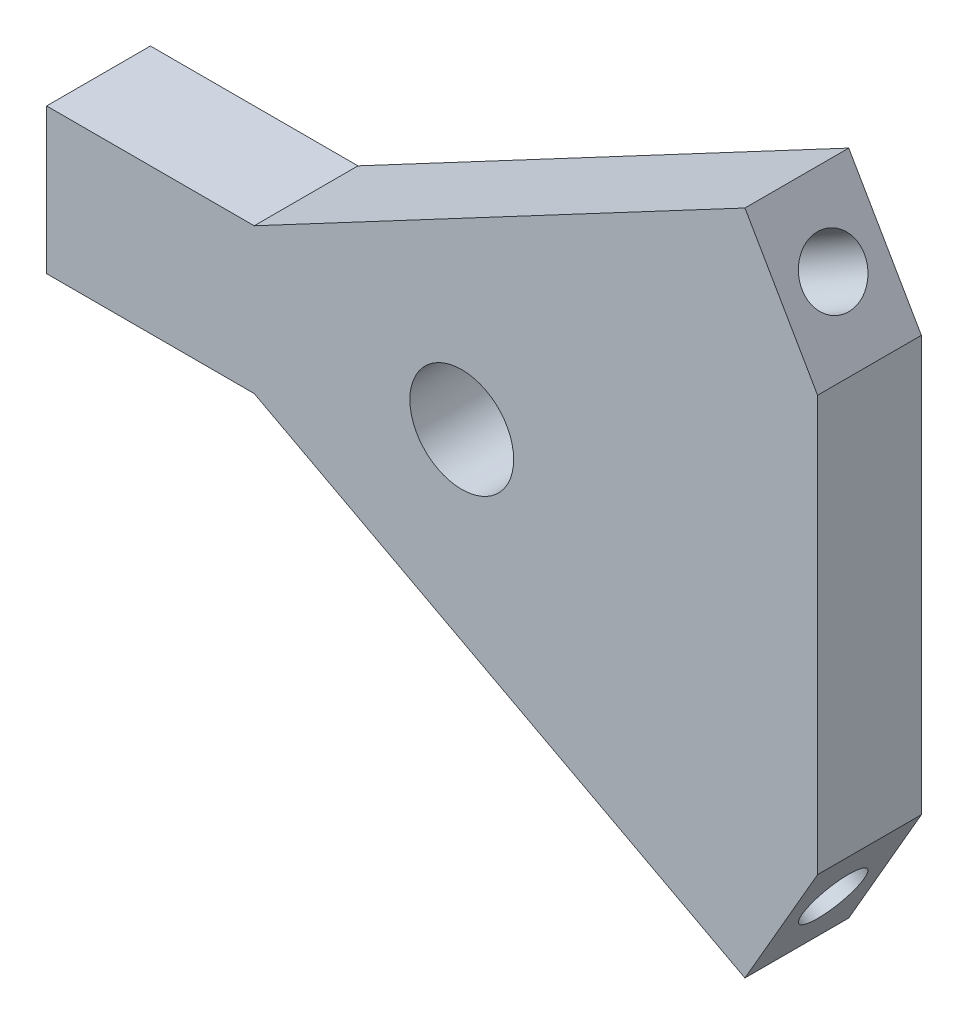
ISO-10303-21;
HEADER;
FILE_DESCRIPTION(('STEP AP214'),'2;1');
FILE_NAME('part.step','',(''),(''),'','','');
FILE_SCHEMA(('AUTOMOTIVE_DESIGN { 1 0 10303 214 1 1 1 1 }'));
ENDSEC;
DATA;
#1=APPLICATION_CONTEXT('core data for automotive mechanical design processes');
#2=APPLICATION_PROTOCOL_DEFINITION('international standard','automotive_design',2000,#1);
#3=PRODUCT_CONTEXT('',#1,'mechanical');
#4=PRODUCT('Part','Part','',(#3));
#5=PRODUCT_RELATED_PRODUCT_CATEGORY('part','',(#4));
#6=PRODUCT_DEFINITION_FORMATION('','',#4);
#7=PRODUCT_DEFINITION_CONTEXT('part definition',#1,'design');
#8=PRODUCT_DEFINITION('design','',#6,#7);
#9=PRODUCT_DEFINITION_SHAPE('','',#8);
#10=(LENGTH_UNIT() NAMED_UNIT(*) SI_UNIT(.MILLI.,.METRE.));
#11=(NAMED_UNIT(*) PLANE_ANGLE_UNIT() SI_UNIT($,.RADIAN.));
#12=(NAMED_UNIT(*) SI_UNIT($,.STERADIAN.) SOLID_ANGLE_UNIT());
#13=UNCERTAINTY_MEASURE_WITH_UNIT(LENGTH_MEASURE(1.E-05),#10,'distance_accuracy_value','');
#14=(GEOMETRIC_REPRESENTATION_CONTEXT(3) GLOBAL_UNCERTAINTY_ASSIGNED_CONTEXT((#13)) GLOBAL_UNIT_ASSIGNED_CONTEXT((#10,
#11,#12)) REPRESENTATION_CONTEXT('',''));
#15=CARTESIAN_POINT('',(0.,0.,0.));
#16=DIRECTION('',(0.,0.,1.));
#17=DIRECTION('',(1.,0.,0.));
#18=AXIS2_PLACEMENT_3D('',#15,#16,#17);
#19=CARTESIAN_POINT('',(47.2820323027583,32.1243556529825,10.));
#20=DIRECTION('',(-0.866025403784442,-0.499999999999995,0.));
#21=DIRECTION('',(0.499999999999995,-0.866025403784442,0.));
#22=AXIS2_PLACEMENT_3D('',#19,#20,#21);
#23=PLANE('',#22);
#24=CARTESIAN_POINT('',(50.7820323027581,26.0621778264916,5.));
#25=DIRECTION('',(0.866025403784441,0.499999999999995,0.));
#26=DIRECTION('',(-0.499999999999995,0.866025403784441,0.));
#27=AXIS2_PLACEMENT_3D('',#24,#25,#26);
#28=CIRCLE('',#27,3.);
#29=CARTESIAN_POINT('',(49.2820323027581,28.6602540378449,5.));
#30=VERTEX_POINT('',#29);
#31=EDGE_CURVE('E183',#30,#30,#28,.T.);
#32=ORIENTED_EDGE('',*,*,#31,.F.);
#33=EDGE_LOOP('',(#32));
#34=FACE_BOUND('',#33,.T.);
#35=DIRECTION('',(-0.499999999999995,0.866025403784442,0.));
#36=VECTOR('',#35,1.);
#37=CARTESIAN_POINT('',(47.2820323027583,32.1243556529825,0.));
#38=LINE('',#37,#36);
#39=CARTESIAN_POINT('',(54.2820323027582,20.0000000000003,0.));
#40=VERTEX_POINT('',#39);
#41=CARTESIAN_POINT('',(47.2820323027583,32.1243556529825,0.));
#42=VERTEX_POINT('',#41);
#43=EDGE_CURVE('E129',#40,#42,#38,.T.);
#44=ORIENTED_EDGE('',*,*,#43,.T.);
#45=DIRECTION('',(0.,0.,-1.));
#46=VECTOR('',#45,1.);
#47=CARTESIAN_POINT('',(47.2820323027583,32.1243556529825,10.));
#48=LINE('',#47,#46);
#49=CARTESIAN_POINT('',(47.2820323027583,32.1243556529825,10.));
#50=VERTEX_POINT('',#49);
#51=EDGE_CURVE('E11',#50,#42,#48,.T.);
#52=ORIENTED_EDGE('',*,*,#51,.F.);
#53=DIRECTION('',(-0.499999999999995,0.866025403784442,0.));
#54=VECTOR('',#53,1.);
#55=CARTESIAN_POINT('',(47.2820323027583,32.1243556529825,10.));
#56=LINE('',#55,#54);
#57=CARTESIAN_POINT('',(54.2820323027582,20.0000000000003,10.));
#58=VERTEX_POINT('',#57);
#59=EDGE_CURVE('E144',#58,#50,#56,.T.);
#60=ORIENTED_EDGE('',*,*,#59,.F.);
#61=DIRECTION('',(0.,0.,-1.));
#62=VECTOR('',#61,1.);
#63=CARTESIAN_POINT('',(54.2820323027582,20.0000000000003,10.));
#64=LINE('',#63,#62);
#65=EDGE_CURVE('E125',#58,#40,#64,.T.);
#66=ORIENTED_EDGE('',*,*,#65,.T.);
#67=EDGE_LOOP('',(#44,#52,#60,#66));
#68=FACE_BOUND('',#67,.T.);
#69=ADVANCED_FACE('F33',(#34,#68),#23,.F.);
#70=CARTESIAN_POINT('',(0.,7.00000000000019,10.));
#71=DIRECTION('',(0.469239355853782,-0.883071020313727,0.));
#72=DIRECTION('',(0.883071020313728,0.469239355853782,0.));
#73=AXIS2_PLACEMENT_3D('',#70,#71,#72);
#74=PLANE('',#73);
#75=DIRECTION('',(-0.883071020313728,-0.469239355853782,0.));
#76=VECTOR('',#75,1.);
#77=CARTESIAN_POINT('',(0.,7.00000000000019,0.));
#78=LINE('',#77,#76);
#79=CARTESIAN_POINT('',(0.,7.00000000000019,0.));
#80=VERTEX_POINT('',#79);
#81=EDGE_CURVE('E132',#42,#80,#78,.T.);
#82=ORIENTED_EDGE('',*,*,#81,.T.);
#83=DIRECTION('',(0.,0.,-1.));
#84=VECTOR('',#83,1.);
#85=CARTESIAN_POINT('',(0.,7.00000000000019,10.));
#86=LINE('',#85,#84);
#87=CARTESIAN_POINT('',(0.,7.00000000000019,10.));
#88=VERTEX_POINT('',#87);
#89=EDGE_CURVE('E41',#88,#80,#86,.T.);
#90=ORIENTED_EDGE('',*,*,#89,.F.);
#91=DIRECTION('',(-0.883071020313728,-0.469239355853782,0.));
#92=VECTOR('',#91,1.);
#93=CARTESIAN_POINT('',(0.,7.00000000000019,10.));
#94=LINE('',#93,#92);
#95=EDGE_CURVE('E92',#50,#88,#94,.T.);
#96=ORIENTED_EDGE('',*,*,#95,.F.);
#97=ORIENTED_EDGE('',*,*,#51,.T.);
#98=EDGE_LOOP('',(#82,#90,#96,#97));
#99=FACE_BOUND('',#98,.T.);
#100=ADVANCED_FACE('F218',(#99),#74,.F.);
#101=CARTESIAN_POINT('',(-20.,7.00000000000019,10.));
#102=DIRECTION('',(0.,-1.,0.));
#103=DIRECTION('',(0.,0.,-1.));
#104=AXIS2_PLACEMENT_3D('',#101,#102,#103);
#105=PLANE('',#104);
#106=DIRECTION('',(-1.,0.,0.));
#107=VECTOR('',#106,1.);
#108=CARTESIAN_POINT('',(-20.,7.00000000000019,0.));
#109=LINE('',#108,#107);
#110=CARTESIAN_POINT('',(-20.,7.00000000000019,0.));
#111=VERTEX_POINT('',#110);
#112=EDGE_CURVE('E135',#80,#111,#109,.T.);
#113=ORIENTED_EDGE('',*,*,#112,.T.);
#114=DIRECTION('',(0.,0.,-1.));
#115=VECTOR('',#114,1.);
#116=CARTESIAN_POINT('',(-20.,7.00000000000019,10.));
#117=LINE('',#116,#115);
#118=CARTESIAN_POINT('',(-20.,7.00000000000019,10.));
#119=VERTEX_POINT('',#118);
#120=EDGE_CURVE('E151',#119,#111,#117,.T.);
#121=ORIENTED_EDGE('',*,*,#120,.F.);
#122=DIRECTION('',(-1.,0.,0.));
#123=VECTOR('',#122,1.);
#124=CARTESIAN_POINT('',(-20.,7.00000000000019,10.));
#125=LINE('',#124,#123);
#126=EDGE_CURVE('E159',#88,#119,#125,.T.);
#127=ORIENTED_EDGE('',*,*,#126,.F.);
#128=ORIENTED_EDGE('',*,*,#89,.T.);
#129=EDGE_LOOP('',(#113,#121,#127,#128));
#130=FACE_BOUND('',#129,.T.);
#131=ADVANCED_FACE('F157',(#130),#105,.F.);
#132=CARTESIAN_POINT('',(-20.,-6.99999999999981,10.));
#133=DIRECTION('',(1.,0.,0.));
#134=DIRECTION('',(0.,0.,-1.));
#135=AXIS2_PLACEMENT_3D('',#132,#133,#134);
#136=PLANE('',#135);
#137=CARTESIAN_POINT('',(-20.,0.,5.));
#138=DIRECTION('',(-1.,0.,0.));
#139=DIRECTION('',(0.,0.,1.));
#140=AXIS2_PLACEMENT_3D('',#137,#138,#139);
#141=CIRCLE('',#140,3.);
#142=CARTESIAN_POINT('',(-20.,0.,8.));
#143=VERTEX_POINT('',#142);
#144=EDGE_CURVE('E177',#143,#143,#141,.T.);
#145=ORIENTED_EDGE('',*,*,#144,.F.);
#146=EDGE_LOOP('',(#145));
#147=FACE_BOUND('',#146,.T.);
#148=DIRECTION('',(0.,-1.,0.));
#149=VECTOR('',#148,1.);
#150=CARTESIAN_POINT('',(-20.,-6.99999999999981,0.));
#151=LINE('',#150,#149);
#152=CARTESIAN_POINT('',(-20.,-6.99999999999981,0.));
#153=VERTEX_POINT('',#152);
#154=EDGE_CURVE('E137',#111,#153,#151,.T.);
#155=ORIENTED_EDGE('',*,*,#154,.T.);
#156=DIRECTION('',(0.,0.,-1.));
#157=VECTOR('',#156,1.);
#158=CARTESIAN_POINT('',(-20.,-6.99999999999981,10.));
#159=LINE('',#158,#157);
#160=CARTESIAN_POINT('',(-20.,-6.99999999999981,10.));
#161=VERTEX_POINT('',#160);
#162=EDGE_CURVE('E148',#161,#153,#159,.T.);
#163=ORIENTED_EDGE('',*,*,#162,.F.);
#164=DIRECTION('',(0.,-1.,0.));
#165=VECTOR('',#164,1.);
#166=CARTESIAN_POINT('',(-20.,-6.99999999999981,10.));
#167=LINE('',#166,#165);
#168=EDGE_CURVE('E171',#119,#161,#167,.T.);
#169=ORIENTED_EDGE('',*,*,#168,.F.);
#170=ORIENTED_EDGE('',*,*,#120,.T.);
#171=EDGE_LOOP('',(#155,#163,#169,#170));
#172=FACE_BOUND('',#171,.T.);
#173=ADVANCED_FACE('F167',(#147,#172),#136,.F.);
#174=CARTESIAN_POINT('',(-20.,-6.99999999999981,10.));
#175=DIRECTION('',(0.,1.,0.));
#176=DIRECTION('',(0.,0.,1.));
#177=AXIS2_PLACEMENT_3D('',#174,#175,#176);
#178=PLANE('',#177);
#179=DIRECTION('',(1.,0.,0.));
#180=VECTOR('',#179,1.);
#181=CARTESIAN_POINT('',(-20.,-6.99999999999981,0.));
#182=LINE('',#181,#180);
#183=CARTESIAN_POINT('',(0.,-6.99999999999981,0.));
#184=VERTEX_POINT('',#183);
#185=EDGE_CURVE('E139',#153,#184,#182,.T.);
#186=ORIENTED_EDGE('',*,*,#185,.T.);
#187=DIRECTION('',(0.,0.,-1.));
#188=VECTOR('',#187,1.);
#189=CARTESIAN_POINT('',(0.,-6.99999999999981,10.));
#190=LINE('',#189,#188);
#191=CARTESIAN_POINT('',(0.,-6.99999999999981,10.));
#192=VERTEX_POINT('',#191);
#193=EDGE_CURVE('E120',#192,#184,#190,.T.);
#194=ORIENTED_EDGE('',*,*,#193,.F.);
#195=DIRECTION('',(1.,0.,0.));
#196=VECTOR('',#195,1.);
#197=CARTESIAN_POINT('',(-20.,-6.99999999999981,10.));
#198=LINE('',#197,#196);
#199=EDGE_CURVE('E111',#161,#192,#198,.T.);
#200=ORIENTED_EDGE('',*,*,#199,.F.);
#201=ORIENTED_EDGE('',*,*,#162,.T.);
#202=EDGE_LOOP('',(#186,#194,#200,#201));
#203=FACE_BOUND('',#202,.T.);
#204=ADVANCED_FACE('F170',(#203),#178,.F.);
#205=CARTESIAN_POINT('',(0.,-6.99999999999981,10.));
#206=DIRECTION('',(0.469239355853787,0.883071020313725,0.));
#207=DIRECTION('',(-0.883071020313725,0.469239355853787,0.));
#208=AXIS2_PLACEMENT_3D('',#205,#206,#207);
#209=PLANE('',#208);
#210=DIRECTION('',(0.883071020313725,-0.469239355853787,0.));
#211=VECTOR('',#210,1.);
#212=CARTESIAN_POINT('',(0.,-6.99999999999981,0.));
#213=LINE('',#212,#211);
#214=CARTESIAN_POINT('',(47.2820323027578,-32.1243556529822,0.));
#215=VERTEX_POINT('',#214);
#216=EDGE_CURVE('E119',#184,#215,#213,.T.);
#217=ORIENTED_EDGE('',*,*,#216,.T.);
#218=DIRECTION('',(0.,0.,-1.));
#219=VECTOR('',#218,1.);
#220=CARTESIAN_POINT('',(47.2820323027578,-32.1243556529822,10.));
#221=LINE('',#220,#219);
#222=CARTESIAN_POINT('',(47.2820323027578,-32.1243556529822,10.));
#223=VERTEX_POINT('',#222);
#224=EDGE_CURVE('E116',#223,#215,#221,.T.);
#225=ORIENTED_EDGE('',*,*,#224,.F.);
#226=DIRECTION('',(0.883071020313725,-0.469239355853787,0.));
#227=VECTOR('',#226,1.);
#228=CARTESIAN_POINT('',(0.,-6.99999999999981,10.));
#229=LINE('',#228,#227);
#230=EDGE_CURVE('E105',#192,#223,#229,.T.);
#231=ORIENTED_EDGE('',*,*,#230,.F.);
#232=ORIENTED_EDGE('',*,*,#193,.T.);
#233=EDGE_LOOP('',(#217,#225,#231,#232));
#234=FACE_BOUND('',#233,.T.);
#235=ADVANCED_FACE('F117',(#234),#209,.F.);
#236=CARTESIAN_POINT('',(47.2820323027578,-32.1243556529822,10.));
#237=DIRECTION('',(-0.866025403784431,0.500000000000012,0.));
#238=DIRECTION('',(-0.500000000000012,-0.866025403784432,0.));
#239=AXIS2_PLACEMENT_3D('',#236,#237,#238);
#240=PLANE('',#239);
#241=CARTESIAN_POINT('',(50.7820323027582,-26.0621778264908,5.));
#242=DIRECTION('',(0.866025403784424,-0.500000000000026,0.));
#243=DIRECTION('',(0.500000000000026,0.866025403784424,0.));
#244=AXIS2_PLACEMENT_3D('',#241,#242,#243);
#245=CIRCLE('',#244,3.);
#246=CARTESIAN_POINT('',(52.2820323027582,-23.4641016151375,5.));
#247=VERTEX_POINT('',#246);
#248=EDGE_CURVE('E189',#247,#247,#245,.T.);
#249=ORIENTED_EDGE('',*,*,#248,.F.);
#250=EDGE_LOOP('',(#249));
#251=FACE_BOUND('',#250,.T.);
#252=DIRECTION('',(0.500000000000012,0.866025403784432,0.));
#253=VECTOR('',#252,1.);
#254=CARTESIAN_POINT('',(47.2820323027578,-32.1243556529822,0.));
#255=LINE('',#254,#253);
#256=CARTESIAN_POINT('',(54.2820323027582,-19.9999999999997,0.));
#257=VERTEX_POINT('',#256);
#258=EDGE_CURVE('E78',#215,#257,#255,.T.);
#259=ORIENTED_EDGE('',*,*,#258,.T.);
#260=DIRECTION('',(0.,0.,-1.));
#261=VECTOR('',#260,1.);
#262=CARTESIAN_POINT('',(54.2820323027582,-19.9999999999997,10.));
#263=LINE('',#262,#261);
#264=CARTESIAN_POINT('',(54.2820323027582,-19.9999999999997,10.));
#265=VERTEX_POINT('',#264);
#266=EDGE_CURVE('E121',#265,#257,#263,.T.);
#267=ORIENTED_EDGE('',*,*,#266,.F.);
#268=DIRECTION('',(0.500000000000012,0.866025403784432,0.));
#269=VECTOR('',#268,1.);
#270=CARTESIAN_POINT('',(47.2820323027578,-32.1243556529822,10.));
#271=LINE('',#270,#269);
#272=EDGE_CURVE('E109',#223,#265,#271,.T.);
#273=ORIENTED_EDGE('',*,*,#272,.F.);
#274=ORIENTED_EDGE('',*,*,#224,.T.);
#275=EDGE_LOOP('',(#259,#267,#273,#274));
#276=FACE_BOUND('',#275,.T.);
#277=ADVANCED_FACE('F123',(#251,#276),#240,.F.);
#278=CARTESIAN_POINT('',(54.2820323027582,20.0000000000003,10.));
#279=DIRECTION('',(-1.,0.,0.));
#280=DIRECTION('',(0.,-1.,0.));
#281=AXIS2_PLACEMENT_3D('',#278,#279,#280);
#282=PLANE('',#281);
#283=DIRECTION('',(0.,1.,0.));
#284=VECTOR('',#283,1.);
#285=CARTESIAN_POINT('',(54.2820323027582,20.0000000000003,0.));
#286=LINE('',#285,#284);
#287=EDGE_CURVE('E84',#257,#40,#286,.T.);
#288=ORIENTED_EDGE('',*,*,#287,.T.);
#289=ORIENTED_EDGE('',*,*,#65,.F.);
#290=DIRECTION('',(0.,1.,0.));
#291=VECTOR('',#290,1.);
#292=CARTESIAN_POINT('',(54.2820323027582,20.0000000000003,10.));
#293=LINE('',#292,#291);
#294=EDGE_CURVE('E49',#265,#58,#293,.T.);
#295=ORIENTED_EDGE('',*,*,#294,.F.);
#296=ORIENTED_EDGE('',*,*,#266,.T.);
#297=EDGE_LOOP('',(#288,#289,#295,#296));
#298=FACE_BOUND('',#297,.T.);
#299=ADVANCED_FACE('F213',(#298),#282,.F.);
#300=CARTESIAN_POINT('',(0.,0.,10.));
#301=DIRECTION('',(0.,0.,1.));
#302=DIRECTION('',(1.,0.,0.));
#303=AXIS2_PLACEMENT_3D('',#300,#301,#302);
#304=PLANE('',#303);
#305=CARTESIAN_POINT('',(20.,0.,10.));
#306=DIRECTION('',(0.,0.,1.));
#307=DIRECTION('',(1.,0.,0.));
#308=AXIS2_PLACEMENT_3D('',#305,#306,#307);
#309=CIRCLE('',#308,5.);
#310=CARTESIAN_POINT('',(25.,0.,10.));
#311=VERTEX_POINT('',#310);
#312=EDGE_CURVE('E192',#311,#311,#309,.T.);
#313=ORIENTED_EDGE('',*,*,#312,.F.);
#314=EDGE_LOOP('',(#313));
#315=FACE_BOUND('',#314,.T.);
#316=ORIENTED_EDGE('',*,*,#59,.T.);
#317=ORIENTED_EDGE('',*,*,#95,.T.);
#318=ORIENTED_EDGE('',*,*,#126,.T.);
#319=ORIENTED_EDGE('',*,*,#168,.T.);
#320=ORIENTED_EDGE('',*,*,#199,.T.);
#321=ORIENTED_EDGE('',*,*,#230,.T.);
#322=ORIENTED_EDGE('',*,*,#272,.T.);
#323=ORIENTED_EDGE('',*,*,#294,.T.);
#324=EDGE_LOOP('',(#316,#317,#318,#319,#320,#321,#322,#323));
#325=FACE_BOUND('',#324,.T.);
#326=ADVANCED_FACE('F107',(#315,#325),#304,.T.);
#327=CARTESIAN_POINT('',(0.,0.,0.));
#328=DIRECTION('',(0.,0.,1.));
#329=DIRECTION('',(1.,0.,0.));
#330=AXIS2_PLACEMENT_3D('',#327,#328,#329);
#331=PLANE('',#330);
#332=CARTESIAN_POINT('',(20.,0.,0.));
#333=DIRECTION('',(0.,0.,-1.));
#334=DIRECTION('',(-1.,0.,0.));
#335=AXIS2_PLACEMENT_3D('',#332,#333,#334);
#336=CIRCLE('',#335,5.);
#337=CARTESIAN_POINT('',(15.,0.,0.));
#338=VERTEX_POINT('',#337);
#339=EDGE_CURVE('E197',#338,#338,#336,.T.);
#340=ORIENTED_EDGE('',*,*,#339,.F.);
#341=EDGE_LOOP('',(#340));
#342=FACE_BOUND('',#341,.T.);
#343=ORIENTED_EDGE('',*,*,#43,.F.);
#344=ORIENTED_EDGE('',*,*,#287,.F.);
#345=ORIENTED_EDGE('',*,*,#258,.F.);
#346=ORIENTED_EDGE('',*,*,#216,.F.);
#347=ORIENTED_EDGE('',*,*,#185,.F.);
#348=ORIENTED_EDGE('',*,*,#154,.F.);
#349=ORIENTED_EDGE('',*,*,#112,.F.);
#350=ORIENTED_EDGE('',*,*,#81,.F.);
#351=EDGE_LOOP('',(#343,#344,#345,#346,#347,#348,#349,#350));
#352=FACE_BOUND('',#351,.T.);
#353=ADVANCED_FACE('F163',(#342,#352),#331,.F.);
#354=CARTESIAN_POINT('',(0.,0.,5.));
#355=DIRECTION('',(-1.,0.,0.));
#356=DIRECTION('',(0.,0.,1.));
#357=AXIS2_PLACEMENT_3D('',#354,#355,#356);
#358=CYLINDRICAL_SURFACE('',#357,3.);
#359=CARTESIAN_POINT('',(0.,0.,5.));
#360=DIRECTION('',(-1.,0.,0.));
#361=DIRECTION('',(0.,0.,1.));
#362=AXIS2_PLACEMENT_3D('',#359,#360,#361);
#363=CIRCLE('',#362,3.);
#364=CARTESIAN_POINT('',(0.,0.,8.));
#365=VERTEX_POINT('',#364);
#366=EDGE_CURVE('E133',#365,#365,#363,.T.);
#367=ORIENTED_EDGE('',*,*,#366,.F.);
#368=EDGE_LOOP('',(#367));
#369=FACE_BOUND('',#368,.T.);
#370=ORIENTED_EDGE('',*,*,#144,.T.);
#371=EDGE_LOOP('',(#370));
#372=FACE_BOUND('',#371,.T.);
#373=ADVANCED_FACE('F204',(#369,#372),#358,.F.);
#374=CARTESIAN_POINT('',(0.,0.,5.));
#375=DIRECTION('',(-1.,0.,0.));
#376=DIRECTION('',(0.,0.,1.));
#377=AXIS2_PLACEMENT_3D('',#374,#375,#376);
#378=PLANE('',#377);
#379=ORIENTED_EDGE('',*,*,#366,.T.);
#380=EDGE_LOOP('',(#379));
#381=FACE_BOUND('',#380,.T.);
#382=ADVANCED_FACE('F210',(#381),#378,.T.);
#383=CARTESIAN_POINT('',(33.4615242270693,16.0621778264917,5.));
#384=DIRECTION('',(0.866025403784441,0.499999999999995,0.));
#385=DIRECTION('',(-0.499999999999995,0.866025403784441,0.));
#386=AXIS2_PLACEMENT_3D('',#383,#384,#385);
#387=CYLINDRICAL_SURFACE('',#386,3.);
#388=CARTESIAN_POINT('',(33.4615242270693,16.0621778264917,5.));
#389=DIRECTION('',(0.866025403784441,0.499999999999995,0.));
#390=DIRECTION('',(-0.499999999999995,0.866025403784441,0.));
#391=AXIS2_PLACEMENT_3D('',#388,#389,#390);
#392=CIRCLE('',#391,3.);
#393=CARTESIAN_POINT('',(31.9615242270693,18.660254037845,5.));
#394=VERTEX_POINT('',#393);
#395=EDGE_CURVE('E180',#394,#394,#392,.T.);
#396=ORIENTED_EDGE('',*,*,#395,.F.);
#397=EDGE_LOOP('',(#396));
#398=FACE_BOUND('',#397,.T.);
#399=ORIENTED_EDGE('',*,*,#31,.T.);
#400=EDGE_LOOP('',(#399));
#401=FACE_BOUND('',#400,.T.);
#402=ADVANCED_FACE('F316',(#398,#401),#387,.F.);
#403=CARTESIAN_POINT('',(33.4615242270693,16.0621778264917,5.));
#404=DIRECTION('',(0.866025403784441,0.499999999999995,0.));
#405=DIRECTION('',(-0.499999999999995,0.866025403784441,0.));
#406=AXIS2_PLACEMENT_3D('',#403,#404,#405);
#407=PLANE('',#406);
#408=ORIENTED_EDGE('',*,*,#395,.T.);
#409=EDGE_LOOP('',(#408));
#410=FACE_BOUND('',#409,.T.);
#411=ADVANCED_FACE('F270',(#410),#407,.T.);
#412=CARTESIAN_POINT('',(33.4615242270697,-16.0621778264903,5.));
#413=DIRECTION('',(0.866025403784424,-0.500000000000026,0.));
#414=DIRECTION('',(0.500000000000026,0.866025403784424,0.));
#415=AXIS2_PLACEMENT_3D('',#412,#413,#414);
#416=CYLINDRICAL_SURFACE('',#415,3.);
#417=CARTESIAN_POINT('',(33.4615242270697,-16.0621778264903,5.));
#418=DIRECTION('',(0.866025403784424,-0.500000000000026,0.));
#419=DIRECTION('',(0.500000000000026,0.866025403784424,0.));
#420=AXIS2_PLACEMENT_3D('',#417,#418,#419);
#421=CIRCLE('',#420,3.);
#422=CARTESIAN_POINT('',(34.9615242270698,-13.464101615137,5.));
#423=VERTEX_POINT('',#422);
#424=EDGE_CURVE('E186',#423,#423,#421,.T.);
#425=ORIENTED_EDGE('',*,*,#424,.F.);
#426=EDGE_LOOP('',(#425));
#427=FACE_BOUND('',#426,.T.);
#428=ORIENTED_EDGE('',*,*,#248,.T.);
#429=EDGE_LOOP('',(#428));
#430=FACE_BOUND('',#429,.T.);
#431=ADVANCED_FACE('F275',(#427,#430),#416,.F.);
#432=CARTESIAN_POINT('',(33.4615242270697,-16.0621778264903,5.));
#433=DIRECTION('',(0.866025403784424,-0.500000000000026,0.));
#434=DIRECTION('',(0.500000000000026,0.866025403784424,0.));
#435=AXIS2_PLACEMENT_3D('',#432,#433,#434);
#436=PLANE('',#435);
#437=ORIENTED_EDGE('',*,*,#424,.T.);
#438=EDGE_LOOP('',(#437));
#439=FACE_BOUND('',#438,.T.);
#440=ADVANCED_FACE('F280',(#439),#436,.T.);
#441=CARTESIAN_POINT('',(20.,0.,20.));
#442=DIRECTION('',(0.,0.,-1.));
#443=DIRECTION('',(-1.,0.,0.));
#444=AXIS2_PLACEMENT_3D('',#441,#442,#443);
#445=CYLINDRICAL_SURFACE('',#444,5.);
#446=ORIENTED_EDGE('',*,*,#312,.T.);
#447=EDGE_LOOP('',(#446));
#448=FACE_BOUND('',#447,.T.);
#449=ORIENTED_EDGE('',*,*,#339,.T.);
#450=EDGE_LOOP('',(#449));
#451=FACE_BOUND('',#450,.T.);
#452=ADVANCED_FACE('F201',(#448,#451),#445,.F.);
#453=CLOSED_SHELL('',(#69,#100,#131,#173,#204,#235,#277,#299,#326,#353,#373,#382,#402,#411,#431,
#440,#452));
#454=MANIFOLD_SOLID_BREP('B2',#453);
#455=ADVANCED_BREP_SHAPE_REPRESENTATION('',(#18,#454),#14);
#456=SHAPE_DEFINITION_REPRESENTATION(#9,#455);
ENDSEC;
END-ISO-10303-21;
